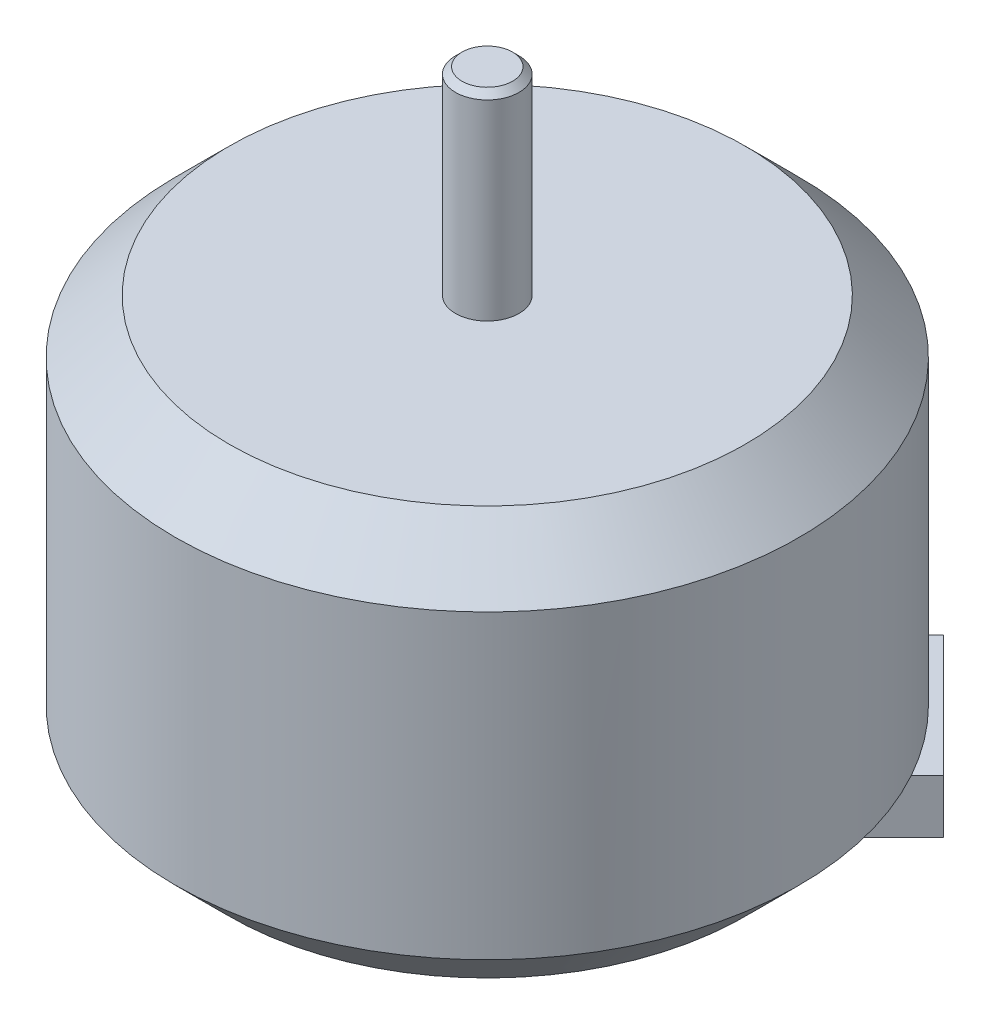
ISO-10303-21;
HEADER;
FILE_DESCRIPTION(('STEP AP214'),'2;1');
FILE_NAME('part.step','',(''),(''),'','','');
FILE_SCHEMA(('AUTOMOTIVE_DESIGN { 1 0 10303 214 1 1 1 1 }'));
ENDSEC;
DATA;
#1=APPLICATION_CONTEXT('core data for automotive mechanical design processes');
#2=APPLICATION_PROTOCOL_DEFINITION('international standard','automotive_design',2000,#1);
#3=PRODUCT_CONTEXT('',#1,'mechanical');
#4=PRODUCT('Part','Part','',(#3));
#5=PRODUCT_RELATED_PRODUCT_CATEGORY('part','',(#4));
#6=PRODUCT_DEFINITION_FORMATION('','',#4);
#7=PRODUCT_DEFINITION_CONTEXT('part definition',#1,'design');
#8=PRODUCT_DEFINITION('design','',#6,#7);
#9=PRODUCT_DEFINITION_SHAPE('','',#8);
#10=(LENGTH_UNIT() NAMED_UNIT(*) SI_UNIT(.MILLI.,.METRE.));
#11=(NAMED_UNIT(*) PLANE_ANGLE_UNIT() SI_UNIT($,.RADIAN.));
#12=(NAMED_UNIT(*) SI_UNIT($,.STERADIAN.) SOLID_ANGLE_UNIT());
#13=UNCERTAINTY_MEASURE_WITH_UNIT(LENGTH_MEASURE(1.E-05),#10,'distance_accuracy_value','');
#14=(GEOMETRIC_REPRESENTATION_CONTEXT(3) GLOBAL_UNCERTAINTY_ASSIGNED_CONTEXT((#13)) GLOBAL_UNIT_ASSIGNED_CONTEXT((#10,
#11,#12)) REPRESENTATION_CONTEXT('',''));
#15=CARTESIAN_POINT('',(0.,0.,0.));
#16=DIRECTION('',(0.,0.,1.));
#17=DIRECTION('',(1.,0.,0.));
#18=AXIS2_PLACEMENT_3D('',#15,#16,#17);
#19=CARTESIAN_POINT('',(0.,19.,0.));
#20=DIRECTION('',(0.,-1.,0.));
#21=DIRECTION('',(0.,0.,-1.));
#22=AXIS2_PLACEMENT_3D('',#19,#20,#21);
#23=CYLINDRICAL_SURFACE('',#22,14.5);
#24=CARTESIAN_POINT('',(0.,16.5,0.));
#25=DIRECTION('',(0.,1.,0.));
#26=DIRECTION('',(0.,0.,1.));
#27=AXIS2_PLACEMENT_3D('',#24,#25,#26);
#28=CIRCLE('',#27,14.5);
#29=CARTESIAN_POINT('',(0.,16.5,14.5));
#30=VERTEX_POINT('',#29);
#31=EDGE_CURVE('E188',#30,#30,#28,.F.);
#32=ORIENTED_EDGE('',*,*,#31,.T.);
#33=EDGE_LOOP('',(#32));
#34=FACE_BOUND('',#33,.T.);
#35=CARTESIAN_POINT('',(0.,2.5,0.));
#36=DIRECTION('',(0.,1.,0.));
#37=DIRECTION('',(0.,0.,1.));
#38=AXIS2_PLACEMENT_3D('',#35,#36,#37);
#39=CIRCLE('',#38,14.5);
#40=CARTESIAN_POINT('',(12.6836287969597,2.5,-7.0267745474673));
#41=VERTEX_POINT('',#40);
#42=CARTESIAN_POINT('',(7.02677454746735,2.5,-12.6836287969597));
#43=VERTEX_POINT('',#42);
#44=EDGE_CURVE('E185',#41,#43,#39,.T.);
#45=ORIENTED_EDGE('',*,*,#44,.T.);
#46=EDGE_CURVE('E66',#43,#41,#39,.T.);
#47=ORIENTED_EDGE('',*,*,#46,.T.);
#48=EDGE_LOOP('',(#45,#47));
#49=FACE_BOUND('',#48,.T.);
#50=ADVANCED_FACE('F45',(#34,#49),#23,.T.);
#51=CARTESIAN_POINT('',(0.,19.,0.));
#52=DIRECTION('',(0.,1.,0.));
#53=DIRECTION('',(0.,0.,1.));
#54=AXIS2_PLACEMENT_3D('',#51,#52,#53);
#55=PLANE('',#54);
#56=CARTESIAN_POINT('',(0.,19.,0.));
#57=DIRECTION('',(0.,1.,0.));
#58=DIRECTION('',(0.,0.,1.));
#59=AXIS2_PLACEMENT_3D('',#56,#57,#58);
#60=CIRCLE('',#59,1.475);
#61=CARTESIAN_POINT('',(0.,19.,1.475));
#62=VERTEX_POINT('',#61);
#63=EDGE_CURVE('E195',#62,#62,#60,.T.);
#64=ORIENTED_EDGE('',*,*,#63,.F.);
#65=EDGE_LOOP('',(#64));
#66=FACE_BOUND('',#65,.T.);
#67=CARTESIAN_POINT('',(0.,19.,0.));
#68=DIRECTION('',(0.,1.,0.));
#69=DIRECTION('',(0.,0.,1.));
#70=AXIS2_PLACEMENT_3D('',#67,#68,#69);
#71=CIRCLE('',#70,12.);
#72=CARTESIAN_POINT('',(0.,19.,12.));
#73=VERTEX_POINT('',#72);
#74=EDGE_CURVE('E181',#73,#73,#71,.T.);
#75=ORIENTED_EDGE('',*,*,#74,.T.);
#76=EDGE_LOOP('',(#75));
#77=FACE_BOUND('',#76,.T.);
#78=ADVANCED_FACE('F273',(#66,#77),#55,.T.);
#79=CARTESIAN_POINT('',(0.,0.,0.));
#80=DIRECTION('',(0.,1.,0.));
#81=DIRECTION('',(0.,0.,1.));
#82=AXIS2_PLACEMENT_3D('',#79,#80,#81);
#83=PLANE('',#82);
#84=DIRECTION('',(-0.707106781186549,0.,0.707106781186546));
#85=VECTOR('',#84,1.);
#86=CARTESIAN_POINT('',(13.4350288425444,0.,-7.778174593052));
#87=LINE('',#86,#85);
#88=CARTESIAN_POINT('',(13.4350288425444,0.,-7.778174593052));
#89=VERTEX_POINT('',#88);
#90=CARTESIAN_POINT('',(10.8284271247462,0.,-5.17157287525378));
#91=VERTEX_POINT('',#90);
#92=EDGE_CURVE('E101',#89,#91,#87,.T.);
#93=ORIENTED_EDGE('',*,*,#92,.T.);
#94=CARTESIAN_POINT('',(0.,0.,0.));
#95=DIRECTION('',(0.,1.,0.));
#96=DIRECTION('',(0.,0.,1.));
#97=AXIS2_PLACEMENT_3D('',#94,#95,#96);
#98=CIRCLE('',#97,12.);
#99=CARTESIAN_POINT('',(5.17157287525383,0.,-10.8284271247462));
#100=VERTEX_POINT('',#99);
#101=EDGE_CURVE('E192',#91,#100,#98,.F.);
#102=ORIENTED_EDGE('',*,*,#101,.T.);
#103=DIRECTION('',(-0.707106781186549,0.,0.707106781186546));
#104=VECTOR('',#103,1.);
#105=CARTESIAN_POINT('',(7.77817459305205,0.,-13.4350288425444));
#106=LINE('',#105,#104);
#107=CARTESIAN_POINT('',(7.77817459305205,0.,-13.4350288425444));
#108=VERTEX_POINT('',#107);
#109=EDGE_CURVE('E127',#108,#100,#106,.T.);
#110=ORIENTED_EDGE('',*,*,#109,.F.);
#111=DIRECTION('',(0.707106781186546,0.,0.707106781186549));
#112=VECTOR('',#111,1.);
#113=CARTESIAN_POINT('',(13.4350288425444,0.,-7.778174593052));
#114=LINE('',#113,#112);
#115=EDGE_CURVE('E118',#108,#89,#114,.T.);
#116=ORIENTED_EDGE('',*,*,#115,.T.);
#117=EDGE_LOOP('',(#93,#102,#110,#116));
#118=FACE_BOUND('',#117,.T.);
#119=CARTESIAN_POINT('',(0.,0.,0.));
#120=DIRECTION('',(0.,1.,0.));
#121=DIRECTION('',(0.,0.,1.));
#122=AXIS2_PLACEMENT_3D('',#119,#120,#121);
#123=CIRCLE('',#122,3.);
#124=CARTESIAN_POINT('',(0.,0.,3.));
#125=VERTEX_POINT('',#124);
#126=EDGE_CURVE('E207',#125,#125,#123,.F.);
#127=ORIENTED_EDGE('',*,*,#126,.F.);
#128=EDGE_LOOP('',(#127));
#129=FACE_BOUND('',#128,.T.);
#130=CARTESIAN_POINT('',(-9.5,0.,0.));
#131=DIRECTION('',(0.,-1.,0.));
#132=DIRECTION('',(0.,0.,-1.));
#133=AXIS2_PLACEMENT_3D('',#130,#131,#132);
#134=CIRCLE('',#133,1.24999999999999);
#135=CARTESIAN_POINT('',(-9.5,0.,-1.24999999999999));
#136=VERTEX_POINT('',#135);
#137=EDGE_CURVE('E149',#136,#136,#134,.T.);
#138=ORIENTED_EDGE('',*,*,#137,.F.);
#139=EDGE_LOOP('',(#138));
#140=FACE_BOUND('',#139,.T.);
#141=CARTESIAN_POINT('',(0.,0.,8.));
#142=DIRECTION('',(0.,-1.,0.));
#143=DIRECTION('',(0.,0.,-1.));
#144=AXIS2_PLACEMENT_3D('',#141,#142,#143);
#145=CIRCLE('',#144,1.24999999999999);
#146=CARTESIAN_POINT('',(0.,0.,6.75000000000001));
#147=VERTEX_POINT('',#146);
#148=EDGE_CURVE('E157',#147,#147,#145,.T.);
#149=ORIENTED_EDGE('',*,*,#148,.F.);
#150=EDGE_LOOP('',(#149));
#151=FACE_BOUND('',#150,.T.);
#152=CARTESIAN_POINT('',(9.5,0.,0.));
#153=DIRECTION('',(0.,-1.,0.));
#154=DIRECTION('',(0.,0.,-1.));
#155=AXIS2_PLACEMENT_3D('',#152,#153,#154);
#156=CIRCLE('',#155,1.24999999999999);
#157=CARTESIAN_POINT('',(9.5,0.,-1.24999999999999));
#158=VERTEX_POINT('',#157);
#159=EDGE_CURVE('E165',#158,#158,#156,.T.);
#160=ORIENTED_EDGE('',*,*,#159,.F.);
#161=EDGE_LOOP('',(#160));
#162=FACE_BOUND('',#161,.T.);
#163=CARTESIAN_POINT('',(0.,0.,-8.));
#164=DIRECTION('',(0.,-1.,0.));
#165=DIRECTION('',(0.,0.,-1.));
#166=AXIS2_PLACEMENT_3D('',#163,#164,#165);
#167=CIRCLE('',#166,1.24999999999999);
#168=CARTESIAN_POINT('',(0.,0.,-9.24999999999999));
#169=VERTEX_POINT('',#168);
#170=EDGE_CURVE('E173',#169,#169,#167,.T.);
#171=ORIENTED_EDGE('',*,*,#170,.F.);
#172=EDGE_LOOP('',(#171));
#173=FACE_BOUND('',#172,.T.);
#174=ADVANCED_FACE('F124',(#118,#129,#140,#151,#162,#173),#83,.F.);
#175=CARTESIAN_POINT('',(0.,19.,0.));
#176=DIRECTION('',(0.,-1.,0.));
#177=DIRECTION('',(0.,0.,-1.));
#178=AXIS2_PLACEMENT_3D('',#175,#176,#177);
#179=CONICAL_SURFACE('',#178,12.,0.785398163397446);
#180=ORIENTED_EDGE('',*,*,#31,.F.);
#181=EDGE_LOOP('',(#180));
#182=FACE_BOUND('',#181,.T.);
#183=ORIENTED_EDGE('',*,*,#74,.F.);
#184=EDGE_LOOP('',(#183));
#185=FACE_BOUND('',#184,.T.);
#186=ADVANCED_FACE('F279',(#182,#185),#179,.T.);
#187=CARTESIAN_POINT('',(0.,2.5,0.));
#188=DIRECTION('',(0.,1.,0.));
#189=DIRECTION('',(0.,0.,1.));
#190=AXIS2_PLACEMENT_3D('',#187,#188,#189);
#191=CONICAL_SURFACE('',#190,14.5,0.78539816339745);
#192=CARTESIAN_POINT('',(5.17142287509758,-0.000199999999995741,-10.8282771245899));
#193=CARTESIAN_POINT('',(5.32682563031823,0.207009690543616,-10.9836798798106));
#194=CARTESIAN_POINT('',(5.48199603324092,0.414567348045427,-11.1388502827333));
#195=CARTESIAN_POINT('',(5.7919301530421,0.830286629030817,-11.4487844025344));
#196=CARTESIAN_POINT('',(5.94669387224612,1.03844824904637,-11.6035481217385));
#197=CARTESIAN_POINT('',(6.25587419122345,1.45528555171157,-11.9127284407158));
#198=CARTESIAN_POINT('',(6.41029079151678,1.6639612335901,-12.0671450410091));
#199=CARTESIAN_POINT('',(6.71882197438373,2.08176120074942,-12.3756762238761));
#200=CARTESIAN_POINT('',(6.87293655522454,2.2908854885897,-12.5297908047169));
#201=CARTESIAN_POINT('',(7.02692167780771,2.5002,-12.6837759273));
#202=B_SPLINE_CURVE_WITH_KNOTS('',3,(#192,#193,#194,#195,#196,#197,#198,#199,#200,#201),
.UNSPECIFIED.,.F.,.F.,(4,2,2,2,4),(0.,0.906157450252952,1.81230970749364,2.71846060627692,
3.624616688856),.UNSPECIFIED.);
#203=EDGE_CURVE('E11',#100,#43,#202,.T.);
#204=ORIENTED_EDGE('',*,*,#203,.F.);
#205=ORIENTED_EDGE('',*,*,#101,.F.);
#206=CARTESIAN_POINT('',(12.6837759273001,2.5002,-7.02692167780765));
#207=CARTESIAN_POINT('',(12.5297908047169,2.2908854885897,-6.87293655522449));
#208=CARTESIAN_POINT('',(12.3756762238761,2.08176120074942,-6.71882197438368));
#209=CARTESIAN_POINT('',(12.0671450410091,1.6639612335901,-6.41029079151673));
#210=CARTESIAN_POINT('',(11.9127284407158,1.45528555171157,-6.2558741912234));
#211=CARTESIAN_POINT('',(11.6035481217385,1.03844824904637,-5.94669387224607));
#212=CARTESIAN_POINT('',(11.4487844025345,0.830286629030816,-5.79193015304204));
#213=CARTESIAN_POINT('',(11.1388502827333,0.414567348045426,-5.48199603324087));
#214=CARTESIAN_POINT('',(10.9836798798106,0.207009690543615,-5.32682563031818));
#215=CARTESIAN_POINT('',(10.8282771245899,-0.000199999999996217,-5.17142287509753));
#216=B_SPLINE_CURVE_WITH_KNOTS('',3,(#206,#207,#208,#209,#210,#211,#212,#213,#214,#215),
.UNSPECIFIED.,.F.,.F.,(4,2,2,2,4),(0.,0.906156082579084,1.81230698136237,2.71845923860305,
3.624616688856),.UNSPECIFIED.);
#217=EDGE_CURVE('E59',#41,#91,#216,.T.);
#218=ORIENTED_EDGE('',*,*,#217,.F.);
#219=ORIENTED_EDGE('',*,*,#46,.F.);
#220=EDGE_LOOP('',(#204,#205,#218,#219));
#221=FACE_BOUND('',#220,.T.);
#222=ADVANCED_FACE('F216',(#221),#191,.T.);
#223=CARTESIAN_POINT('',(0.,3.,-8.));
#224=DIRECTION('',(0.,-1.,0.));
#225=DIRECTION('',(0.,0.,-1.));
#226=AXIS2_PLACEMENT_3D('',#223,#224,#225);
#227=CONICAL_SURFACE('',#226,1.25,1.02974425867665);
#228=CARTESIAN_POINT('',(0.,3.75107577378445,-8.));
#229=VERTEX_POINT('',#228);
#230=VERTEX_LOOP('',#229);
#231=FACE_BOUND('',#230,.T.);
#232=CARTESIAN_POINT('',(0.,3.,-8.));
#233=DIRECTION('',(0.,-1.,0.));
#234=DIRECTION('',(0.,0.,-1.));
#235=AXIS2_PLACEMENT_3D('',#232,#233,#234);
#236=CIRCLE('',#235,1.25);
#237=CARTESIAN_POINT('',(0.,3.,-9.25));
#238=VERTEX_POINT('',#237);
#239=EDGE_CURVE('E177',#238,#238,#236,.T.);
#240=ORIENTED_EDGE('',*,*,#239,.T.);
#241=EDGE_LOOP('',(#240));
#242=FACE_BOUND('',#241,.T.);
#243=ADVANCED_FACE('F268',(#231,#242),#227,.F.);
#244=CARTESIAN_POINT('',(0.,0.,-8.));
#245=DIRECTION('',(0.,-1.,0.));
#246=DIRECTION('',(0.,0.,-1.));
#247=AXIS2_PLACEMENT_3D('',#244,#245,#246);
#248=CYLINDRICAL_SURFACE('',#247,1.24999999999999);
#249=ORIENTED_EDGE('',*,*,#239,.F.);
#250=EDGE_LOOP('',(#249));
#251=FACE_BOUND('',#250,.T.);
#252=ORIENTED_EDGE('',*,*,#170,.T.);
#253=EDGE_LOOP('',(#252));
#254=FACE_BOUND('',#253,.T.);
#255=ADVANCED_FACE('F264',(#251,#254),#248,.F.);
#256=CARTESIAN_POINT('',(9.5,3.,0.));
#257=DIRECTION('',(0.,-1.,0.));
#258=DIRECTION('',(0.,0.,-1.));
#259=AXIS2_PLACEMENT_3D('',#256,#257,#258);
#260=CONICAL_SURFACE('',#259,1.25,1.02974425867665);
#261=CARTESIAN_POINT('',(9.5,3.75107577378445,0.));
#262=VERTEX_POINT('',#261);
#263=VERTEX_LOOP('',#262);
#264=FACE_BOUND('',#263,.T.);
#265=CARTESIAN_POINT('',(9.5,3.,0.));
#266=DIRECTION('',(0.,-1.,0.));
#267=DIRECTION('',(0.,0.,-1.));
#268=AXIS2_PLACEMENT_3D('',#265,#266,#267);
#269=CIRCLE('',#268,1.25);
#270=CARTESIAN_POINT('',(9.5,3.,-1.25));
#271=VERTEX_POINT('',#270);
#272=EDGE_CURVE('E169',#271,#271,#269,.T.);
#273=ORIENTED_EDGE('',*,*,#272,.T.);
#274=EDGE_LOOP('',(#273));
#275=FACE_BOUND('',#274,.T.);
#276=ADVANCED_FACE('F260',(#264,#275),#260,.F.);
#277=CARTESIAN_POINT('',(9.5,0.,0.));
#278=DIRECTION('',(0.,-1.,0.));
#279=DIRECTION('',(0.,0.,-1.));
#280=AXIS2_PLACEMENT_3D('',#277,#278,#279);
#281=CYLINDRICAL_SURFACE('',#280,1.24999999999999);
#282=ORIENTED_EDGE('',*,*,#272,.F.);
#283=EDGE_LOOP('',(#282));
#284=FACE_BOUND('',#283,.T.);
#285=ORIENTED_EDGE('',*,*,#159,.T.);
#286=EDGE_LOOP('',(#285));
#287=FACE_BOUND('',#286,.T.);
#288=ADVANCED_FACE('F256',(#284,#287),#281,.F.);
#289=CARTESIAN_POINT('',(0.,3.,8.));
#290=DIRECTION('',(0.,-1.,0.));
#291=DIRECTION('',(0.,0.,-1.));
#292=AXIS2_PLACEMENT_3D('',#289,#290,#291);
#293=CONICAL_SURFACE('',#292,1.25,1.02974425867665);
#294=CARTESIAN_POINT('',(0.,3.75107577378445,8.));
#295=VERTEX_POINT('',#294);
#296=VERTEX_LOOP('',#295);
#297=FACE_BOUND('',#296,.T.);
#298=CARTESIAN_POINT('',(0.,3.,8.));
#299=DIRECTION('',(0.,-1.,0.));
#300=DIRECTION('',(0.,0.,-1.));
#301=AXIS2_PLACEMENT_3D('',#298,#299,#300);
#302=CIRCLE('',#301,1.25);
#303=CARTESIAN_POINT('',(0.,3.,6.75));
#304=VERTEX_POINT('',#303);
#305=EDGE_CURVE('E161',#304,#304,#302,.T.);
#306=ORIENTED_EDGE('',*,*,#305,.T.);
#307=EDGE_LOOP('',(#306));
#308=FACE_BOUND('',#307,.T.);
#309=ADVANCED_FACE('F252',(#297,#308),#293,.F.);
#310=CARTESIAN_POINT('',(0.,0.,8.));
#311=DIRECTION('',(0.,-1.,0.));
#312=DIRECTION('',(0.,0.,-1.));
#313=AXIS2_PLACEMENT_3D('',#310,#311,#312);
#314=CYLINDRICAL_SURFACE('',#313,1.24999999999999);
#315=ORIENTED_EDGE('',*,*,#305,.F.);
#316=EDGE_LOOP('',(#315));
#317=FACE_BOUND('',#316,.T.);
#318=ORIENTED_EDGE('',*,*,#148,.T.);
#319=EDGE_LOOP('',(#318));
#320=FACE_BOUND('',#319,.T.);
#321=ADVANCED_FACE('F248',(#317,#320),#314,.F.);
#322=CARTESIAN_POINT('',(-9.5,3.,0.));
#323=DIRECTION('',(0.,-1.,0.));
#324=DIRECTION('',(0.,0.,-1.));
#325=AXIS2_PLACEMENT_3D('',#322,#323,#324);
#326=CONICAL_SURFACE('',#325,1.25,1.02974425867665);
#327=CARTESIAN_POINT('',(-9.5,3.75107577378445,0.));
#328=VERTEX_POINT('',#327);
#329=VERTEX_LOOP('',#328);
#330=FACE_BOUND('',#329,.T.);
#331=CARTESIAN_POINT('',(-9.5,3.,0.));
#332=DIRECTION('',(0.,-1.,0.));
#333=DIRECTION('',(0.,0.,-1.));
#334=AXIS2_PLACEMENT_3D('',#331,#332,#333);
#335=CIRCLE('',#334,1.25);
#336=CARTESIAN_POINT('',(-9.5,3.,-1.25));
#337=VERTEX_POINT('',#336);
#338=EDGE_CURVE('E153',#337,#337,#335,.T.);
#339=ORIENTED_EDGE('',*,*,#338,.T.);
#340=EDGE_LOOP('',(#339));
#341=FACE_BOUND('',#340,.T.);
#342=ADVANCED_FACE('F244',(#330,#341),#326,.F.);
#343=CARTESIAN_POINT('',(-9.5,0.,0.));
#344=DIRECTION('',(0.,-1.,0.));
#345=DIRECTION('',(0.,0.,-1.));
#346=AXIS2_PLACEMENT_3D('',#343,#344,#345);
#347=CYLINDRICAL_SURFACE('',#346,1.24999999999999);
#348=ORIENTED_EDGE('',*,*,#338,.F.);
#349=EDGE_LOOP('',(#348));
#350=FACE_BOUND('',#349,.T.);
#351=ORIENTED_EDGE('',*,*,#137,.T.);
#352=EDGE_LOOP('',(#351));
#353=FACE_BOUND('',#352,.T.);
#354=ADVANCED_FACE('F240',(#350,#353),#347,.F.);
#355=CARTESIAN_POINT('',(0.,28.2,0.));
#356=DIRECTION('',(0.,1.,0.));
#357=DIRECTION('',(0.,0.,1.));
#358=AXIS2_PLACEMENT_3D('',#355,#356,#357);
#359=PLANE('',#358);
#360=CARTESIAN_POINT('',(0.,28.2,0.));
#361=DIRECTION('',(0.,1.,0.));
#362=DIRECTION('',(0.,0.,1.));
#363=AXIS2_PLACEMENT_3D('',#360,#361,#362);
#364=CIRCLE('',#363,1.175);
#365=CARTESIAN_POINT('',(0.,28.2,1.175));
#366=VERTEX_POINT('',#365);
#367=EDGE_CURVE('E203',#366,#366,#364,.T.);
#368=ORIENTED_EDGE('',*,*,#367,.T.);
#369=EDGE_LOOP('',(#368));
#370=FACE_BOUND('',#369,.T.);
#371=ADVANCED_FACE('F236',(#370),#359,.T.);
#372=CARTESIAN_POINT('',(0.,-3.27786324029777,0.));
#373=DIRECTION('',(0.,-1.,0.));
#374=DIRECTION('',(0.,0.,-1.));
#375=AXIS2_PLACEMENT_3D('',#372,#373,#374);
#376=CYLINDRICAL_SURFACE('',#375,1.475);
#377=CARTESIAN_POINT('',(0.,27.9,0.));
#378=DIRECTION('',(0.,1.,0.));
#379=DIRECTION('',(0.,0.,1.));
#380=AXIS2_PLACEMENT_3D('',#377,#378,#379);
#381=CIRCLE('',#380,1.475);
#382=CARTESIAN_POINT('',(0.,27.9,1.475));
#383=VERTEX_POINT('',#382);
#384=EDGE_CURVE('E199',#383,#383,#381,.F.);
#385=ORIENTED_EDGE('',*,*,#384,.T.);
#386=EDGE_LOOP('',(#385));
#387=FACE_BOUND('',#386,.T.);
#388=ORIENTED_EDGE('',*,*,#63,.T.);
#389=EDGE_LOOP('',(#388));
#390=FACE_BOUND('',#389,.T.);
#391=ADVANCED_FACE('F233',(#387,#390),#376,.T.);
#392=CARTESIAN_POINT('',(0.,27.9,0.));
#393=DIRECTION('',(0.,-1.,0.));
#394=DIRECTION('',(0.,0.,-1.));
#395=AXIS2_PLACEMENT_3D('',#392,#393,#394);
#396=CONICAL_SURFACE('',#395,1.475,0.785398163397442);
#397=ORIENTED_EDGE('',*,*,#367,.F.);
#398=EDGE_LOOP('',(#397));
#399=FACE_BOUND('',#398,.T.);
#400=ORIENTED_EDGE('',*,*,#384,.F.);
#401=EDGE_LOOP('',(#400));
#402=FACE_BOUND('',#401,.T.);
#403=ADVANCED_FACE('F47',(#399,#402),#396,.T.);
#404=CARTESIAN_POINT('',(0.,-1.,0.));
#405=DIRECTION('',(0.,1.,0.));
#406=DIRECTION('',(0.,0.,1.));
#407=AXIS2_PLACEMENT_3D('',#404,#405,#406);
#408=CYLINDRICAL_SURFACE('',#407,3.);
#409=CARTESIAN_POINT('',(0.,-1.,0.));
#410=DIRECTION('',(0.,-1.,0.));
#411=DIRECTION('',(0.,0.,-1.));
#412=AXIS2_PLACEMENT_3D('',#409,#410,#411);
#413=CIRCLE('',#412,3.);
#414=CARTESIAN_POINT('',(0.,-1.,-3.));
#415=VERTEX_POINT('',#414);
#416=EDGE_CURVE('E139',#415,#415,#413,.T.);
#417=ORIENTED_EDGE('',*,*,#416,.F.);
#418=EDGE_LOOP('',(#417));
#419=FACE_BOUND('',#418,.T.);
#420=ORIENTED_EDGE('',*,*,#126,.T.);
#421=EDGE_LOOP('',(#420));
#422=FACE_BOUND('',#421,.T.);
#423=ADVANCED_FACE('F228',(#419,#422),#408,.T.);
#424=CARTESIAN_POINT('',(0.,-1.,0.));
#425=DIRECTION('',(0.,-1.,0.));
#426=DIRECTION('',(0.,0.,-1.));
#427=AXIS2_PLACEMENT_3D('',#424,#425,#426);
#428=PLANE('',#427);
#429=ORIENTED_EDGE('',*,*,#416,.T.);
#430=EDGE_LOOP('',(#429));
#431=FACE_BOUND('',#430,.T.);
#432=ADVANCED_FACE('F224',(#431),#428,.T.);
#433=CARTESIAN_POINT('',(7.77817459305205,2.5,-13.4350288425444));
#434=DIRECTION('',(-0.707106781186546,0.,-0.707106781186549));
#435=DIRECTION('',(-0.707106781186549,0.,0.707106781186546));
#436=AXIS2_PLACEMENT_3D('',#433,#434,#435);
#437=PLANE('',#436);
#438=ORIENTED_EDGE('',*,*,#109,.T.);
#439=ORIENTED_EDGE('',*,*,#203,.T.);
#440=DIRECTION('',(-0.707106781186549,0.,0.707106781186546));
#441=VECTOR('',#440,1.);
#442=CARTESIAN_POINT('',(7.77817459305205,2.5,-13.4350288425444));
#443=LINE('',#442,#441);
#444=CARTESIAN_POINT('',(7.77817459305205,2.5,-13.4350288425444));
#445=VERTEX_POINT('',#444);
#446=EDGE_CURVE('E140',#445,#43,#443,.T.);
#447=ORIENTED_EDGE('',*,*,#446,.F.);
#448=DIRECTION('',(0.,-1.,0.));
#449=VECTOR('',#448,1.);
#450=CARTESIAN_POINT('',(7.77817459305205,2.5,-13.4350288425444));
#451=LINE('',#450,#449);
#452=EDGE_CURVE('E111',#445,#108,#451,.T.);
#453=ORIENTED_EDGE('',*,*,#452,.T.);
#454=EDGE_LOOP('',(#438,#439,#447,#453));
#455=FACE_BOUND('',#454,.T.);
#456=ADVANCED_FACE('F227',(#455),#437,.T.);
#457=CARTESIAN_POINT('',(13.4350288425444,2.5,-7.778174593052));
#458=DIRECTION('',(0.,1.,0.));
#459=DIRECTION('',(0.,0.,1.));
#460=AXIS2_PLACEMENT_3D('',#457,#458,#459);
#461=PLANE('',#460);
#462=ORIENTED_EDGE('',*,*,#446,.T.);
#463=ORIENTED_EDGE('',*,*,#44,.F.);
#464=DIRECTION('',(-0.707106781186549,0.,0.707106781186546));
#465=VECTOR('',#464,1.);
#466=CARTESIAN_POINT('',(13.4350288425444,2.5,-7.778174593052));
#467=LINE('',#466,#465);
#468=CARTESIAN_POINT('',(13.4350288425444,2.5,-7.778174593052));
#469=VERTEX_POINT('',#468);
#470=EDGE_CURVE('E110',#469,#41,#467,.T.);
#471=ORIENTED_EDGE('',*,*,#470,.F.);
#472=DIRECTION('',(-0.707106781186546,0.,-0.707106781186549));
#473=VECTOR('',#472,1.);
#474=CARTESIAN_POINT('',(13.4350288425444,2.5,-7.778174593052));
#475=LINE('',#474,#473);
#476=EDGE_CURVE('E121',#469,#445,#475,.T.);
#477=ORIENTED_EDGE('',*,*,#476,.T.);
#478=EDGE_LOOP('',(#462,#463,#471,#477));
#479=FACE_BOUND('',#478,.T.);
#480=ADVANCED_FACE('F223',(#479),#461,.T.);
#481=CARTESIAN_POINT('',(13.4350288425444,2.5,-7.778174593052));
#482=DIRECTION('',(0.707106781186546,0.,0.707106781186549));
#483=DIRECTION('',(0.707106781186549,0.,-0.707106781186546));
#484=AXIS2_PLACEMENT_3D('',#481,#482,#483);
#485=PLANE('',#484);
#486=ORIENTED_EDGE('',*,*,#470,.T.);
#487=ORIENTED_EDGE('',*,*,#217,.T.);
#488=ORIENTED_EDGE('',*,*,#92,.F.);
#489=DIRECTION('',(0.,1.,0.));
#490=VECTOR('',#489,1.);
#491=CARTESIAN_POINT('',(13.4350288425444,2.5,-7.778174593052));
#492=LINE('',#491,#490);
#493=EDGE_CURVE('E105',#89,#469,#492,.T.);
#494=ORIENTED_EDGE('',*,*,#493,.T.);
#495=EDGE_LOOP('',(#486,#487,#488,#494));
#496=FACE_BOUND('',#495,.T.);
#497=ADVANCED_FACE('F104',(#496),#485,.T.);
#498=CARTESIAN_POINT('',(10.6066017177982,0.,-10.6066017177982));
#499=DIRECTION('',(-0.707106781186549,0.,0.707106781186546));
#500=DIRECTION('',(0.707106781186546,0.,0.707106781186549));
#501=AXIS2_PLACEMENT_3D('',#498,#499,#500);
#502=PLANE('',#501);
#503=ORIENTED_EDGE('',*,*,#115,.F.);
#504=ORIENTED_EDGE('',*,*,#452,.F.);
#505=ORIENTED_EDGE('',*,*,#476,.F.);
#506=ORIENTED_EDGE('',*,*,#493,.F.);
#507=EDGE_LOOP('',(#503,#504,#505,#506));
#508=FACE_BOUND('',#507,.T.);
#509=ADVANCED_FACE('F116',(#508),#502,.F.);
#510=CLOSED_SHELL('',(#50,#78,#174,#186,#222,#243,#255,#276,#288,#309,#321,#342,#354,#371,#391,
#403,#423,#432,#456,#480,#497,#509));
#511=MANIFOLD_SOLID_BREP('B2',#510);
#512=ADVANCED_BREP_SHAPE_REPRESENTATION('',(#18,#511),#14);
#513=SHAPE_DEFINITION_REPRESENTATION(#9,#512);
ENDSEC;
END-ISO-10303-21;
